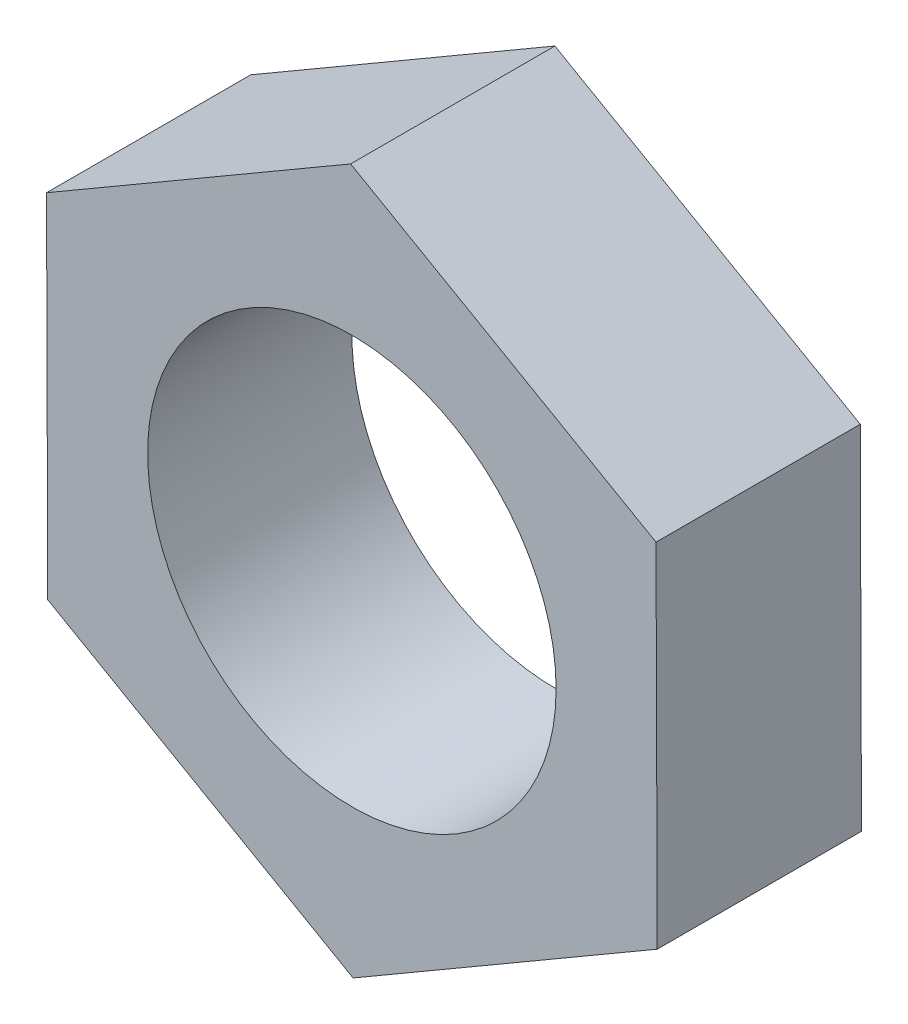
ISO-10303-21;
HEADER;
FILE_DESCRIPTION(('STEP AP214'),'2;1');
FILE_NAME('part.step','',(''),(''),'','','');
FILE_SCHEMA(('AUTOMOTIVE_DESIGN { 1 0 10303 214 1 1 1 1 }'));
ENDSEC;
DATA;
#1=APPLICATION_CONTEXT('core data for automotive mechanical design processes');
#2=APPLICATION_PROTOCOL_DEFINITION('international standard','automotive_design',2000,#1);
#3=PRODUCT_CONTEXT('',#1,'mechanical');
#4=PRODUCT('Part','Part','',(#3));
#5=PRODUCT_RELATED_PRODUCT_CATEGORY('part','',(#4));
#6=PRODUCT_DEFINITION_FORMATION('','',#4);
#7=PRODUCT_DEFINITION_CONTEXT('part definition',#1,'design');
#8=PRODUCT_DEFINITION('design','',#6,#7);
#9=PRODUCT_DEFINITION_SHAPE('','',#8);
#10=(LENGTH_UNIT() NAMED_UNIT(*) SI_UNIT(.MILLI.,.METRE.));
#11=(NAMED_UNIT(*) PLANE_ANGLE_UNIT() SI_UNIT($,.RADIAN.));
#12=(NAMED_UNIT(*) SI_UNIT($,.STERADIAN.) SOLID_ANGLE_UNIT());
#13=UNCERTAINTY_MEASURE_WITH_UNIT(LENGTH_MEASURE(1.E-05),#10,'distance_accuracy_value','');
#14=(GEOMETRIC_REPRESENTATION_CONTEXT(3) GLOBAL_UNCERTAINTY_ASSIGNED_CONTEXT((#13)) GLOBAL_UNIT_ASSIGNED_CONTEXT((#10,
#11,#12)) REPRESENTATION_CONTEXT('',''));
#15=CARTESIAN_POINT('',(0.,0.,0.));
#16=DIRECTION('',(0.,0.,1.));
#17=DIRECTION('',(1.,0.,0.));
#18=AXIS2_PLACEMENT_3D('',#15,#16,#17);
#19=CARTESIAN_POINT('',(0.,0.,1.5625));
#20=DIRECTION('',(0.,0.,1.));
#21=DIRECTION('',(1.,0.,0.));
#22=AXIS2_PLACEMENT_3D('',#19,#20,#21);
#23=PLANE('',#22);
#24=DIRECTION('',(0.864283086786845,0.503005711592029,0.));
#25=VECTOR('',#24,1.);
#26=CARTESIAN_POINT('',(0.0112235213354617,-3.23053211625654,1.5625));
#27=LINE('',#26,#25);
#28=CARTESIAN_POINT('',(0.0112235213354617,-3.23053211625654,1.5625));
#29=VERTEX_POINT('',#28);
#30=CARTESIAN_POINT('',(2.8033346410874,-1.60554620353185,1.5625));
#31=VERTEX_POINT('',#30);
#32=EDGE_CURVE('E130',#29,#31,#27,.T.);
#33=ORIENTED_EDGE('',*,*,#32,.T.);
#34=DIRECTION('',(-0.00347418109394328,0.999993965014653,0.));
#35=VECTOR('',#34,1.);
#36=CARTESIAN_POINT('',(2.8033346410874,-1.60554620353185,1.5625));
#37=LINE('',#36,#35);
#38=CARTESIAN_POINT('',(2.79211111975194,1.6249859127247,1.5625));
#39=VERTEX_POINT('',#38);
#40=EDGE_CURVE('E88',#31,#39,#37,.T.);
#41=ORIENTED_EDGE('',*,*,#40,.T.);
#42=DIRECTION('',(-0.867757267880788,0.496988253422624,0.));
#43=VECTOR('',#42,1.);
#44=CARTESIAN_POINT('',(2.79211111975194,1.6249859127247,1.5625));
#45=LINE('',#44,#43);
#46=CARTESIAN_POINT('',(-0.0112235213354617,3.23053211625654,1.5625));
#47=VERTEX_POINT('',#46);
#48=EDGE_CURVE('E101',#39,#47,#45,.T.);
#49=ORIENTED_EDGE('',*,*,#48,.T.);
#50=DIRECTION('',(-0.864283086786845,-0.503005711592029,0.));
#51=VECTOR('',#50,1.);
#52=CARTESIAN_POINT('',(-0.0112235213354617,3.23053211625654,1.5625));
#53=LINE('',#52,#51);
#54=CARTESIAN_POINT('',(-2.8033346410874,1.60554620353185,1.5625));
#55=VERTEX_POINT('',#54);
#56=EDGE_CURVE('E95',#47,#55,#53,.T.);
#57=ORIENTED_EDGE('',*,*,#56,.T.);
#58=DIRECTION('',(0.00347418109394308,-0.999993965014653,0.));
#59=VECTOR('',#58,1.);
#60=CARTESIAN_POINT('',(-2.8033346410874,1.60554620353185,1.5625));
#61=LINE('',#60,#59);
#62=CARTESIAN_POINT('',(-2.79211111975194,-1.6249859127247,1.5625));
#63=VERTEX_POINT('',#62);
#64=EDGE_CURVE('E99',#55,#63,#61,.T.);
#65=ORIENTED_EDGE('',*,*,#64,.T.);
#66=DIRECTION('',(0.867757267880788,-0.496988253422624,0.));
#67=VECTOR('',#66,1.);
#68=CARTESIAN_POINT('',(-2.79211111975194,-1.6249859127247,1.5625));
#69=LINE('',#68,#67);
#70=EDGE_CURVE('E51',#63,#29,#69,.T.);
#71=ORIENTED_EDGE('',*,*,#70,.T.);
#72=EDGE_LOOP('',(#33,#41,#49,#57,#65,#71));
#73=FACE_BOUND('',#72,.T.);
#74=CARTESIAN_POINT('',(0.,0.,1.5625));
#75=DIRECTION('',(0.,0.,1.));
#76=DIRECTION('',(1.,0.,0.));
#77=AXIS2_PLACEMENT_3D('',#74,#75,#76);
#78=CIRCLE('',#77,1.875);
#79=CARTESIAN_POINT('',(1.875,0.,1.5625));
#80=VERTEX_POINT('',#79);
#81=EDGE_CURVE('E123',#80,#80,#78,.T.);
#82=ORIENTED_EDGE('',*,*,#81,.F.);
#83=EDGE_LOOP('',(#82));
#84=FACE_BOUND('',#83,.T.);
#85=ADVANCED_FACE('F34',(#73,#84),#23,.T.);
#86=CARTESIAN_POINT('',(0.,0.,-0.3125));
#87=DIRECTION('',(0.,0.,1.));
#88=DIRECTION('',(1.,0.,0.));
#89=AXIS2_PLACEMENT_3D('',#86,#87,#88);
#90=PLANE('',#89);
#91=DIRECTION('',(0.864283086786845,0.503005711592029,0.));
#92=VECTOR('',#91,1.);
#93=CARTESIAN_POINT('',(0.0112235213354617,-3.23053211625654,-0.3125));
#94=LINE('',#93,#92);
#95=CARTESIAN_POINT('',(0.0112235213354617,-3.23053211625654,-0.3125));
#96=VERTEX_POINT('',#95);
#97=CARTESIAN_POINT('',(2.8033346410874,-1.60554620353185,-0.3125));
#98=VERTEX_POINT('',#97);
#99=EDGE_CURVE('E119',#96,#98,#94,.T.);
#100=ORIENTED_EDGE('',*,*,#99,.F.);
#101=DIRECTION('',(0.867757267880788,-0.496988253422624,0.));
#102=VECTOR('',#101,1.);
#103=CARTESIAN_POINT('',(-2.79211111975194,-1.6249859127247,-0.3125));
#104=LINE('',#103,#102);
#105=CARTESIAN_POINT('',(-2.79211111975194,-1.6249859127247,-0.3125));
#106=VERTEX_POINT('',#105);
#107=EDGE_CURVE('E80',#106,#96,#104,.T.);
#108=ORIENTED_EDGE('',*,*,#107,.F.);
#109=DIRECTION('',(0.00347418109394308,-0.999993965014653,0.));
#110=VECTOR('',#109,1.);
#111=CARTESIAN_POINT('',(-2.8033346410874,1.60554620353185,-0.3125));
#112=LINE('',#111,#110);
#113=CARTESIAN_POINT('',(-2.8033346410874,1.60554620353185,-0.3125));
#114=VERTEX_POINT('',#113);
#115=EDGE_CURVE('E74',#114,#106,#112,.T.);
#116=ORIENTED_EDGE('',*,*,#115,.F.);
#117=DIRECTION('',(-0.864283086786845,-0.503005711592029,0.));
#118=VECTOR('',#117,1.);
#119=CARTESIAN_POINT('',(-0.0112235213354617,3.23053211625654,-0.3125));
#120=LINE('',#119,#118);
#121=CARTESIAN_POINT('',(-0.0112235213354617,3.23053211625654,-0.3125));
#122=VERTEX_POINT('',#121);
#123=EDGE_CURVE('E109',#122,#114,#120,.T.);
#124=ORIENTED_EDGE('',*,*,#123,.F.);
#125=DIRECTION('',(-0.867757267880788,0.496988253422624,0.));
#126=VECTOR('',#125,1.);
#127=CARTESIAN_POINT('',(2.79211111975194,1.6249859127247,-0.3125));
#128=LINE('',#127,#126);
#129=CARTESIAN_POINT('',(2.79211111975194,1.6249859127247,-0.3125));
#130=VERTEX_POINT('',#129);
#131=EDGE_CURVE('E125',#130,#122,#128,.T.);
#132=ORIENTED_EDGE('',*,*,#131,.F.);
#133=DIRECTION('',(-0.00347418109394328,0.999993965014653,0.));
#134=VECTOR('',#133,1.);
#135=CARTESIAN_POINT('',(2.8033346410874,-1.60554620353185,-0.3125));
#136=LINE('',#135,#134);
#137=EDGE_CURVE('E122',#98,#130,#136,.T.);
#138=ORIENTED_EDGE('',*,*,#137,.F.);
#139=EDGE_LOOP('',(#100,#108,#116,#124,#132,#138));
#140=FACE_BOUND('',#139,.T.);
#141=CARTESIAN_POINT('',(0.,0.,-0.3125));
#142=DIRECTION('',(0.,0.,1.));
#143=DIRECTION('',(1.,0.,0.));
#144=AXIS2_PLACEMENT_3D('',#141,#142,#143);
#145=CIRCLE('',#144,1.875);
#146=CARTESIAN_POINT('',(1.875,0.,-0.3125));
#147=VERTEX_POINT('',#146);
#148=EDGE_CURVE('E223',#147,#147,#145,.T.);
#149=ORIENTED_EDGE('',*,*,#148,.T.);
#150=EDGE_LOOP('',(#149));
#151=FACE_BOUND('',#150,.T.);
#152=ADVANCED_FACE('F139',(#140,#151),#90,.F.);
#153=CARTESIAN_POINT('',(0.0112235213354617,-3.23053211625654,1.5625));
#154=DIRECTION('',(-0.503005711592029,0.864283086786845,0.));
#155=DIRECTION('',(-0.864283086786845,-0.503005711592029,0.));
#156=AXIS2_PLACEMENT_3D('',#153,#154,#155);
#157=PLANE('',#156);
#158=ORIENTED_EDGE('',*,*,#99,.T.);
#159=DIRECTION('',(0.,0.,-1.));
#160=VECTOR('',#159,1.);
#161=CARTESIAN_POINT('',(2.8033346410874,-1.60554620353185,1.5625));
#162=LINE('',#161,#160);
#163=EDGE_CURVE('E11',#31,#98,#162,.T.);
#164=ORIENTED_EDGE('',*,*,#163,.F.);
#165=ORIENTED_EDGE('',*,*,#32,.F.);
#166=DIRECTION('',(0.,0.,-1.));
#167=VECTOR('',#166,1.);
#168=CARTESIAN_POINT('',(0.0112235213354617,-3.23053211625654,1.5625));
#169=LINE('',#168,#167);
#170=EDGE_CURVE('E115',#29,#96,#169,.T.);
#171=ORIENTED_EDGE('',*,*,#170,.T.);
#172=EDGE_LOOP('',(#158,#164,#165,#171));
#173=FACE_BOUND('',#172,.T.);
#174=ADVANCED_FACE('F36',(#173),#157,.F.);
#175=CARTESIAN_POINT('',(2.8033346410874,-1.60554620353185,1.5625));
#176=DIRECTION('',(-0.999993965014653,-0.00347418109394328,0.));
#177=DIRECTION('',(0.00347418109394328,-0.999993965014653,0.));
#178=AXIS2_PLACEMENT_3D('',#175,#176,#177);
#179=PLANE('',#178);
#180=ORIENTED_EDGE('',*,*,#137,.T.);
#181=DIRECTION('',(0.,0.,-1.));
#182=VECTOR('',#181,1.);
#183=CARTESIAN_POINT('',(2.79211111975194,1.6249859127247,1.5625));
#184=LINE('',#183,#182);
#185=EDGE_CURVE('E43',#39,#130,#184,.T.);
#186=ORIENTED_EDGE('',*,*,#185,.F.);
#187=ORIENTED_EDGE('',*,*,#40,.F.);
#188=ORIENTED_EDGE('',*,*,#163,.T.);
#189=EDGE_LOOP('',(#180,#186,#187,#188));
#190=FACE_BOUND('',#189,.T.);
#191=ADVANCED_FACE('F164',(#190),#179,.F.);
#192=CARTESIAN_POINT('',(2.79211111975194,1.6249859127247,1.5625));
#193=DIRECTION('',(-0.496988253422624,-0.867757267880788,0.));
#194=DIRECTION('',(0.867757267880788,-0.496988253422624,0.));
#195=AXIS2_PLACEMENT_3D('',#192,#193,#194);
#196=PLANE('',#195);
#197=ORIENTED_EDGE('',*,*,#131,.T.);
#198=DIRECTION('',(0.,0.,-1.));
#199=VECTOR('',#198,1.);
#200=CARTESIAN_POINT('',(-0.0112235213354617,3.23053211625654,1.5625));
#201=LINE('',#200,#199);
#202=EDGE_CURVE('E110',#47,#122,#201,.T.);
#203=ORIENTED_EDGE('',*,*,#202,.F.);
#204=ORIENTED_EDGE('',*,*,#48,.F.);
#205=ORIENTED_EDGE('',*,*,#185,.T.);
#206=EDGE_LOOP('',(#197,#203,#204,#205));
#207=FACE_BOUND('',#206,.T.);
#208=ADVANCED_FACE('F136',(#207),#196,.F.);
#209=CARTESIAN_POINT('',(-0.0112235213354617,3.23053211625654,1.5625));
#210=DIRECTION('',(0.503005711592029,-0.864283086786845,0.));
#211=DIRECTION('',(0.864283086786845,0.503005711592029,0.));
#212=AXIS2_PLACEMENT_3D('',#209,#210,#211);
#213=PLANE('',#212);
#214=ORIENTED_EDGE('',*,*,#123,.T.);
#215=DIRECTION('',(0.,0.,-1.));
#216=VECTOR('',#215,1.);
#217=CARTESIAN_POINT('',(-2.8033346410874,1.60554620353185,1.5625));
#218=LINE('',#217,#216);
#219=EDGE_CURVE('E106',#55,#114,#218,.T.);
#220=ORIENTED_EDGE('',*,*,#219,.F.);
#221=ORIENTED_EDGE('',*,*,#56,.F.);
#222=ORIENTED_EDGE('',*,*,#202,.T.);
#223=EDGE_LOOP('',(#214,#220,#221,#222));
#224=FACE_BOUND('',#223,.T.);
#225=ADVANCED_FACE('F107',(#224),#213,.F.);
#226=CARTESIAN_POINT('',(-2.8033346410874,1.60554620353185,1.5625));
#227=DIRECTION('',(0.999993965014653,0.00347418109394308,0.));
#228=DIRECTION('',(-0.00347418109394308,0.999993965014653,0.));
#229=AXIS2_PLACEMENT_3D('',#226,#227,#228);
#230=PLANE('',#229);
#231=ORIENTED_EDGE('',*,*,#115,.T.);
#232=DIRECTION('',(0.,0.,-1.));
#233=VECTOR('',#232,1.);
#234=CARTESIAN_POINT('',(-2.79211111975194,-1.6249859127247,1.5625));
#235=LINE('',#234,#233);
#236=EDGE_CURVE('E111',#63,#106,#235,.T.);
#237=ORIENTED_EDGE('',*,*,#236,.F.);
#238=ORIENTED_EDGE('',*,*,#64,.F.);
#239=ORIENTED_EDGE('',*,*,#219,.T.);
#240=EDGE_LOOP('',(#231,#237,#238,#239));
#241=FACE_BOUND('',#240,.T.);
#242=ADVANCED_FACE('F113',(#241),#230,.F.);
#243=CARTESIAN_POINT('',(-2.79211111975194,-1.6249859127247,1.5625));
#244=DIRECTION('',(0.496988253422624,0.867757267880788,0.));
#245=DIRECTION('',(-0.867757267880788,0.496988253422624,0.));
#246=AXIS2_PLACEMENT_3D('',#243,#244,#245);
#247=PLANE('',#246);
#248=ORIENTED_EDGE('',*,*,#107,.T.);
#249=ORIENTED_EDGE('',*,*,#170,.F.);
#250=ORIENTED_EDGE('',*,*,#70,.F.);
#251=ORIENTED_EDGE('',*,*,#236,.T.);
#252=EDGE_LOOP('',(#248,#249,#250,#251));
#253=FACE_BOUND('',#252,.T.);
#254=ADVANCED_FACE('F144',(#253),#247,.F.);
#255=CARTESIAN_POINT('',(0.,0.,1.5625));
#256=DIRECTION('',(0.,0.,-1.));
#257=DIRECTION('',(-1.,0.,0.));
#258=AXIS2_PLACEMENT_3D('',#255,#256,#257);
#259=CYLINDRICAL_SURFACE('',#258,1.875);
#260=ORIENTED_EDGE('',*,*,#81,.T.);
#261=EDGE_LOOP('',(#260));
#262=FACE_BOUND('',#261,.T.);
#263=ORIENTED_EDGE('',*,*,#148,.F.);
#264=EDGE_LOOP('',(#263));
#265=FACE_BOUND('',#264,.T.);
#266=ADVANCED_FACE('F146',(#262,#265),#259,.F.);
#267=CLOSED_SHELL('',(#85,#152,#174,#191,#208,#225,#242,#254,#266));
#268=MANIFOLD_SOLID_BREP('B2',#267);
#269=ADVANCED_BREP_SHAPE_REPRESENTATION('',(#18,#268),#14);
#270=SHAPE_DEFINITION_REPRESENTATION(#9,#269);
ENDSEC;
END-ISO-10303-21;
